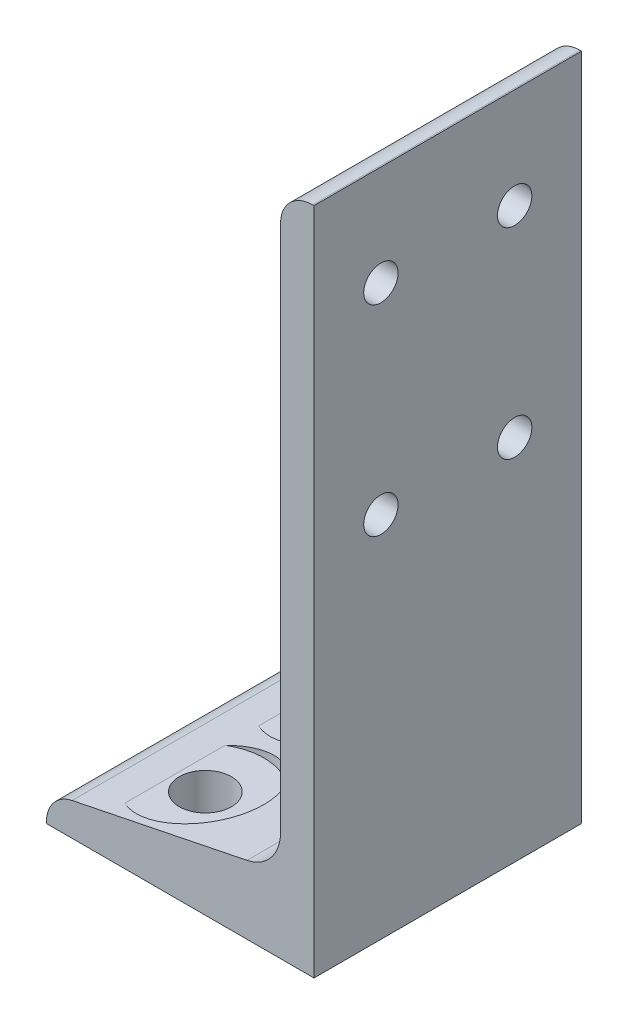
ISO-10303-21;
HEADER;
FILE_DESCRIPTION(('STEP AP214'),'2;1');
FILE_NAME('part.step','',(''),(''),'','','');
FILE_SCHEMA(('AUTOMOTIVE_DESIGN { 1 0 10303 214 1 1 1 1 }'));
ENDSEC;
DATA;
#1=APPLICATION_CONTEXT('core data for automotive mechanical design processes');
#2=APPLICATION_PROTOCOL_DEFINITION('international standard','automotive_design',2000,#1);
#3=PRODUCT_CONTEXT('',#1,'mechanical');
#4=PRODUCT('Part','Part','',(#3));
#5=PRODUCT_RELATED_PRODUCT_CATEGORY('part','',(#4));
#6=PRODUCT_DEFINITION_FORMATION('','',#4);
#7=PRODUCT_DEFINITION_CONTEXT('part definition',#1,'design');
#8=PRODUCT_DEFINITION('design','',#6,#7);
#9=PRODUCT_DEFINITION_SHAPE('','',#8);
#10=(LENGTH_UNIT() NAMED_UNIT(*) SI_UNIT(.MILLI.,.METRE.));
#11=(NAMED_UNIT(*) PLANE_ANGLE_UNIT() SI_UNIT($,.RADIAN.));
#12=(NAMED_UNIT(*) SI_UNIT($,.STERADIAN.) SOLID_ANGLE_UNIT());
#13=UNCERTAINTY_MEASURE_WITH_UNIT(LENGTH_MEASURE(1.E-05),#10,'distance_accuracy_value','');
#14=(GEOMETRIC_REPRESENTATION_CONTEXT(3) GLOBAL_UNCERTAINTY_ASSIGNED_CONTEXT((#13)) GLOBAL_UNIT_ASSIGNED_CONTEXT((#10,
#11,#12)) REPRESENTATION_CONTEXT('',''));
#15=CARTESIAN_POINT('',(0.,0.,0.));
#16=DIRECTION('',(0.,0.,1.));
#17=DIRECTION('',(1.,0.,0.));
#18=AXIS2_PLACEMENT_3D('',#15,#16,#17);
#19=CARTESIAN_POINT('',(-45.9207101191459,6.22734349305051,25.4));
#20=DIRECTION('',(0.199591554978008,-0.979879181930844,0.));
#21=DIRECTION('',(0.979879181930844,0.199591554978008,0.));
#22=AXIS2_PLACEMENT_3D('',#19,#20,#21);
#23=PLANE('',#22);
#24=CARTESIAN_POINT('',(-33.3247999999999,8.79300396773239,12.7000000000001));
#25=DIRECTION('',(0.199591554978008,-0.979879181930844,0.));
#26=DIRECTION('',(-0.979879181930844,-0.199591554978008,0.));
#27=AXIS2_PLACEMENT_3D('',#24,#25,#26);
#28=ELLIPSE('',#27,11.340683836249,11.1125);
#29=CARTESIAN_POINT('',(-39.0835715493763,7.6200000000001,22.203904802348));
#30=VERTEX_POINT('',#29);
#31=CARTESIAN_POINT('',(-39.0835715493763,7.61999999999999,3.19609519765196));
#32=VERTEX_POINT('',#31);
#33=EDGE_CURVE('E119',#30,#32,#28,.F.);
#34=ORIENTED_EDGE('',*,*,#33,.F.);
#35=DIRECTION('',(0.,0.,1.));
#36=VECTOR('',#35,1.);
#37=CARTESIAN_POINT('',(-39.0835715493763,7.6200000000001,25.4));
#38=LINE('',#37,#36);
#39=EDGE_CURVE('E312',#32,#30,#38,.T.);
#40=ORIENTED_EDGE('',*,*,#39,.F.);
#41=EDGE_LOOP('',(#34,#40));
#42=FACE_BOUND('',#41,.T.);
#43=DIRECTION('',(-0.979879181930845,-0.199591554978008,0.));
#44=VECTOR('',#43,1.);
#45=CARTESIAN_POINT('',(-45.9207101191459,6.22734349305051,-25.4));
#46=LINE('',#45,#44);
#47=CARTESIAN_POINT('',(-12.7032420323621,12.9934083611798,-25.4));
#48=VERTEX_POINT('',#47);
#49=CARTESIAN_POINT('',(-45.9207101191459,6.22734349305051,-25.4));
#50=VERTEX_POINT('',#49);
#51=EDGE_CURVE('E271',#48,#50,#46,.T.);
#52=ORIENTED_EDGE('',*,*,#51,.T.);
#53=DIRECTION('',(0.,0.,-1.));
#54=VECTOR('',#53,1.);
#55=CARTESIAN_POINT('',(-45.9207101191459,6.22734349305051,25.4));
#56=LINE('',#55,#54);
#57=CARTESIAN_POINT('',(-45.9207101191459,6.22734349305051,25.4));
#58=VERTEX_POINT('',#57);
#59=EDGE_CURVE('E306',#58,#50,#56,.T.);
#60=ORIENTED_EDGE('',*,*,#59,.F.);
#61=DIRECTION('',(-0.979879181930845,-0.199591554978008,0.));
#62=VECTOR('',#61,1.);
#63=CARTESIAN_POINT('',(-45.9207101191459,6.22734349305051,25.4));
#64=LINE('',#63,#62);
#65=CARTESIAN_POINT('',(-12.7032420323621,12.9934083611798,25.4));
#66=VERTEX_POINT('',#65);
#67=EDGE_CURVE('E251',#66,#58,#64,.T.);
#68=ORIENTED_EDGE('',*,*,#67,.F.);
#69=DIRECTION('',(0.,0.,-1.));
#70=VECTOR('',#69,1.);
#71=CARTESIAN_POINT('',(-12.7032420323621,12.9934083611798,25.4));
#72=LINE('',#71,#70);
#73=EDGE_CURVE('E309',#66,#48,#72,.T.);
#74=ORIENTED_EDGE('',*,*,#73,.T.);
#75=EDGE_LOOP('',(#52,#60,#68,#74));
#76=FACE_BOUND('',#75,.T.);
#77=CARTESIAN_POINT('',(-33.3247999999999,8.79300396773239,-12.7000000000001));
#78=DIRECTION('',(0.199591554978008,-0.979879181930844,0.));
#79=DIRECTION('',(-0.979879181930844,-0.199591554978008,0.));
#80=AXIS2_PLACEMENT_3D('',#77,#78,#79);
#81=ELLIPSE('',#80,11.340683836249,11.1125);
#82=CARTESIAN_POINT('',(-39.0835715493763,7.61999999999999,-3.19609519765196));
#83=VERTEX_POINT('',#82);
#84=CARTESIAN_POINT('',(-39.0835715493763,7.62000000000013,-22.203904802348));
#85=VERTEX_POINT('',#84);
#86=EDGE_CURVE('E11',#83,#85,#81,.F.);
#87=ORIENTED_EDGE('',*,*,#86,.F.);
#88=DIRECTION('',(0.,0.,1.));
#89=VECTOR('',#88,1.);
#90=CARTESIAN_POINT('',(-39.0835715493763,7.6200000000001,25.4));
#91=LINE('',#90,#89);
#92=EDGE_CURVE('E44',#85,#83,#91,.T.);
#93=ORIENTED_EDGE('',*,*,#92,.F.);
#94=EDGE_LOOP('',(#87,#93));
#95=FACE_BOUND('',#94,.T.);
#96=ADVANCED_FACE('F36',(#42,#76,#95),#23,.F.);
#97=CARTESIAN_POINT('',(-14.2875,20.7711993677559,25.4));
#98=DIRECTION('',(0.,0.,-1.));
#99=DIRECTION('',(-1.,0.,0.));
#100=AXIS2_PLACEMENT_3D('',#97,#98,#99);
#101=CYLINDRICAL_SURFACE('',#100,7.9375);
#102=CARTESIAN_POINT('',(-14.2875,20.7711993677559,-25.4));
#103=DIRECTION('',(0.,0.,-1.));
#104=DIRECTION('',(1.,0.,0.));
#105=AXIS2_PLACEMENT_3D('',#102,#103,#104);
#106=CIRCLE('',#105,7.9375);
#107=CARTESIAN_POINT('',(-6.35000000000008,20.7711993677559,-25.4));
#108=VERTEX_POINT('',#107);
#109=EDGE_CURVE('E247',#108,#48,#106,.T.);
#110=ORIENTED_EDGE('',*,*,#109,.T.);
#111=ORIENTED_EDGE('',*,*,#73,.F.);
#112=CARTESIAN_POINT('',(-14.2875,20.7711993677559,25.4));
#113=DIRECTION('',(0.,0.,-1.));
#114=DIRECTION('',(1.,0.,0.));
#115=AXIS2_PLACEMENT_3D('',#112,#113,#114);
#116=CIRCLE('',#115,7.9375);
#117=CARTESIAN_POINT('',(-6.35000000000008,20.7711993677559,25.4));
#118=VERTEX_POINT('',#117);
#119=EDGE_CURVE('E248',#118,#66,#116,.T.);
#120=ORIENTED_EDGE('',*,*,#119,.F.);
#121=DIRECTION('',(0.,0.,-1.));
#122=VECTOR('',#121,1.);
#123=CARTESIAN_POINT('',(-6.35000000000008,20.7711993677559,25.4));
#124=LINE('',#123,#122);
#125=EDGE_CURVE('E268',#118,#108,#124,.T.);
#126=ORIENTED_EDGE('',*,*,#125,.T.);
#127=EDGE_LOOP('',(#110,#111,#120,#126));
#128=FACE_BOUND('',#127,.T.);
#129=ADVANCED_FACE('F38',(#128),#101,.F.);
#130=CARTESIAN_POINT('',(-44.7040000000001,0.254000000000087,25.4));
#131=DIRECTION('',(0.,0.,-1.));
#132=DIRECTION('',(-1.,0.,0.));
#133=AXIS2_PLACEMENT_3D('',#130,#131,#132);
#134=CYLINDRICAL_SURFACE('',#133,6.09599999999999);
#135=CARTESIAN_POINT('',(-44.7040000000001,0.254000000000115,-25.4));
#136=DIRECTION('',(0.,0.,1.));
#137=DIRECTION('',(-1.,0.,0.));
#138=AXIS2_PLACEMENT_3D('',#135,#136,#137);
#139=CIRCLE('',#138,6.09599999999999);
#140=CARTESIAN_POINT('',(-50.8,0.254000000000115,-25.4));
#141=VERTEX_POINT('',#140);
#142=EDGE_CURVE('E273',#50,#141,#139,.T.);
#143=ORIENTED_EDGE('',*,*,#142,.T.);
#144=DIRECTION('',(0.,0.,-1.));
#145=VECTOR('',#144,1.);
#146=CARTESIAN_POINT('',(-50.8,0.254000000000087,25.4));
#147=LINE('',#146,#145);
#148=CARTESIAN_POINT('',(-50.8,0.254000000000087,25.4));
#149=VERTEX_POINT('',#148);
#150=EDGE_CURVE('E303',#149,#141,#147,.T.);
#151=ORIENTED_EDGE('',*,*,#150,.F.);
#152=CARTESIAN_POINT('',(-44.7040000000001,0.254000000000087,25.4));
#153=DIRECTION('',(0.,0.,1.));
#154=DIRECTION('',(-1.,0.,0.));
#155=AXIS2_PLACEMENT_3D('',#152,#153,#154);
#156=CIRCLE('',#155,6.09599999999999);
#157=EDGE_CURVE('E254',#58,#149,#156,.T.);
#158=ORIENTED_EDGE('',*,*,#157,.F.);
#159=ORIENTED_EDGE('',*,*,#59,.T.);
#160=EDGE_LOOP('',(#143,#151,#158,#159));
#161=FACE_BOUND('',#160,.T.);
#162=ADVANCED_FACE('F129',(#161),#134,.T.);
#163=CARTESIAN_POINT('',(-50.8,1.11022302462516E-13,25.4));
#164=DIRECTION('',(1.,0.,0.));
#165=DIRECTION('',(0.,0.,-1.));
#166=AXIS2_PLACEMENT_3D('',#163,#164,#165);
#167=PLANE('',#166);
#168=DIRECTION('',(0.,-1.,0.));
#169=VECTOR('',#168,1.);
#170=CARTESIAN_POINT('',(-50.8,1.11022302462516E-13,-25.4));
#171=LINE('',#170,#169);
#172=CARTESIAN_POINT('',(-50.8,1.11022302462516E-13,-25.4));
#173=VERTEX_POINT('',#172);
#174=EDGE_CURVE('E275',#141,#173,#171,.T.);
#175=ORIENTED_EDGE('',*,*,#174,.T.);
#176=DIRECTION('',(0.,0.,-1.));
#177=VECTOR('',#176,1.);
#178=CARTESIAN_POINT('',(-50.8,1.11022302462516E-13,25.4));
#179=LINE('',#178,#177);
#180=CARTESIAN_POINT('',(-50.8,1.11022302462516E-13,25.4));
#181=VERTEX_POINT('',#180);
#182=EDGE_CURVE('E300',#181,#173,#179,.T.);
#183=ORIENTED_EDGE('',*,*,#182,.F.);
#184=DIRECTION('',(0.,-1.,0.));
#185=VECTOR('',#184,1.);
#186=CARTESIAN_POINT('',(-50.8,1.11022302462516E-13,25.4));
#187=LINE('',#186,#185);
#188=EDGE_CURVE('E256',#149,#181,#187,.T.);
#189=ORIENTED_EDGE('',*,*,#188,.F.);
#190=ORIENTED_EDGE('',*,*,#150,.T.);
#191=EDGE_LOOP('',(#175,#183,#189,#190));
#192=FACE_BOUND('',#191,.T.);
#193=ADVANCED_FACE('F136',(#192),#167,.F.);
#194=CARTESIAN_POINT('',(0.,1.11022302462516E-13,25.4));
#195=DIRECTION('',(0.,1.,0.));
#196=DIRECTION('',(-1.,0.,0.));
#197=AXIS2_PLACEMENT_3D('',#194,#195,#196);
#198=PLANE('',#197);
#199=CARTESIAN_POINT('',(-33.3247999999999,1.11022302462516E-13,-12.7000000000001));
#200=DIRECTION('',(0.,1.,0.));
#201=DIRECTION('',(0.,0.,1.));
#202=AXIS2_PLACEMENT_3D('',#199,#200,#201);
#203=CIRCLE('',#202,4.95299999999999);
#204=CARTESIAN_POINT('',(-33.3247999999999,1.11022302462516E-13,-7.74700000000008));
#205=VERTEX_POINT('',#204);
#206=EDGE_CURVE('E236',#205,#205,#203,.T.);
#207=ORIENTED_EDGE('',*,*,#206,.T.);
#208=EDGE_LOOP('',(#207));
#209=FACE_BOUND('',#208,.T.);
#210=CARTESIAN_POINT('',(-33.3247999999999,1.11022302462516E-13,12.7000000000001));
#211=DIRECTION('',(0.,1.,0.));
#212=DIRECTION('',(0.,0.,1.));
#213=AXIS2_PLACEMENT_3D('',#210,#211,#212);
#214=CIRCLE('',#213,4.953);
#215=CARTESIAN_POINT('',(-33.3247999999999,1.11022302462516E-13,17.6530000000001));
#216=VERTEX_POINT('',#215);
#217=EDGE_CURVE('E122',#216,#216,#214,.T.);
#218=ORIENTED_EDGE('',*,*,#217,.T.);
#219=EDGE_LOOP('',(#218));
#220=FACE_BOUND('',#219,.T.);
#221=DIRECTION('',(1.,0.,0.));
#222=VECTOR('',#221,1.);
#223=CARTESIAN_POINT('',(0.,1.11022302462516E-13,-25.4));
#224=LINE('',#223,#222);
#225=CARTESIAN_POINT('',(0.,1.11022302462516E-13,-25.4));
#226=VERTEX_POINT('',#225);
#227=EDGE_CURVE('E277',#173,#226,#224,.T.);
#228=ORIENTED_EDGE('',*,*,#227,.T.);
#229=DIRECTION('',(0.,0.,-1.));
#230=VECTOR('',#229,1.);
#231=CARTESIAN_POINT('',(0.,1.11022302462516E-13,25.4));
#232=LINE('',#231,#230);
#233=CARTESIAN_POINT('',(0.,1.11022302462516E-13,25.4));
#234=VERTEX_POINT('',#233);
#235=EDGE_CURVE('E297',#234,#226,#232,.T.);
#236=ORIENTED_EDGE('',*,*,#235,.F.);
#237=DIRECTION('',(1.,0.,0.));
#238=VECTOR('',#237,1.);
#239=CARTESIAN_POINT('',(0.,1.11022302462516E-13,25.4));
#240=LINE('',#239,#238);
#241=EDGE_CURVE('E258',#181,#234,#240,.T.);
#242=ORIENTED_EDGE('',*,*,#241,.F.);
#243=ORIENTED_EDGE('',*,*,#182,.T.);
#244=EDGE_LOOP('',(#228,#236,#242,#243));
#245=FACE_BOUND('',#244,.T.);
#246=ADVANCED_FACE('F140',(#209,#220,#245),#198,.F.);
#247=CARTESIAN_POINT('',(0.,127.,25.4));
#248=DIRECTION('',(-1.,0.,0.));
#249=DIRECTION('',(0.,-1.,0.));
#250=AXIS2_PLACEMENT_3D('',#247,#248,#249);
#251=PLANE('',#250);
#252=CARTESIAN_POINT('',(0.,69.8500000000001,12.7));
#253=DIRECTION('',(-1.,0.,0.));
#254=DIRECTION('',(0.,-1.,0.));
#255=AXIS2_PLACEMENT_3D('',#252,#253,#254);
#256=CIRCLE('',#255,3.2639);
#257=CARTESIAN_POINT('',(0.,66.5861000000001,12.7));
#258=VERTEX_POINT('',#257);
#259=EDGE_CURVE('E210',#258,#258,#256,.T.);
#260=ORIENTED_EDGE('',*,*,#259,.T.);
#261=EDGE_LOOP('',(#260));
#262=FACE_BOUND('',#261,.T.);
#263=CARTESIAN_POINT('',(0.,107.95,12.7));
#264=DIRECTION('',(-1.,0.,0.));
#265=DIRECTION('',(0.,-1.,0.));
#266=AXIS2_PLACEMENT_3D('',#263,#264,#265);
#267=CIRCLE('',#266,3.2639);
#268=CARTESIAN_POINT('',(0.,104.6861,12.7));
#269=VERTEX_POINT('',#268);
#270=EDGE_CURVE('E218',#269,#269,#267,.T.);
#271=ORIENTED_EDGE('',*,*,#270,.T.);
#272=EDGE_LOOP('',(#271));
#273=FACE_BOUND('',#272,.T.);
#274=CARTESIAN_POINT('',(0.,107.95,-12.7));
#275=DIRECTION('',(-1.,0.,0.));
#276=DIRECTION('',(0.,-1.,0.));
#277=AXIS2_PLACEMENT_3D('',#274,#275,#276);
#278=CIRCLE('',#277,3.2639);
#279=CARTESIAN_POINT('',(0.,104.6861,-12.7));
#280=VERTEX_POINT('',#279);
#281=EDGE_CURVE('E224',#280,#280,#278,.T.);
#282=ORIENTED_EDGE('',*,*,#281,.T.);
#283=EDGE_LOOP('',(#282));
#284=FACE_BOUND('',#283,.T.);
#285=CARTESIAN_POINT('',(0.,69.8500000000001,-12.7));
#286=DIRECTION('',(-1.,0.,0.));
#287=DIRECTION('',(0.,-1.,0.));
#288=AXIS2_PLACEMENT_3D('',#285,#286,#287);
#289=CIRCLE('',#288,3.2639);
#290=CARTESIAN_POINT('',(0.,66.5861000000001,-12.7));
#291=VERTEX_POINT('',#290);
#292=EDGE_CURVE('E230',#291,#291,#289,.T.);
#293=ORIENTED_EDGE('',*,*,#292,.T.);
#294=EDGE_LOOP('',(#293));
#295=FACE_BOUND('',#294,.T.);
#296=DIRECTION('',(0.,1.,0.));
#297=VECTOR('',#296,1.);
#298=CARTESIAN_POINT('',(0.,127.,-25.4));
#299=LINE('',#298,#297);
#300=CARTESIAN_POINT('',(0.,127.,-25.4));
#301=VERTEX_POINT('',#300);
#302=EDGE_CURVE('E279',#226,#301,#299,.T.);
#303=ORIENTED_EDGE('',*,*,#302,.T.);
#304=DIRECTION('',(0.,0.,-1.));
#305=VECTOR('',#304,1.);
#306=CARTESIAN_POINT('',(0.,127.,25.4));
#307=LINE('',#306,#305);
#308=CARTESIAN_POINT('',(0.,127.,25.4));
#309=VERTEX_POINT('',#308);
#310=EDGE_CURVE('E294',#309,#301,#307,.T.);
#311=ORIENTED_EDGE('',*,*,#310,.F.);
#312=DIRECTION('',(0.,1.,0.));
#313=VECTOR('',#312,1.);
#314=CARTESIAN_POINT('',(0.,127.,25.4));
#315=LINE('',#314,#313);
#316=EDGE_CURVE('E260',#234,#309,#315,.T.);
#317=ORIENTED_EDGE('',*,*,#316,.F.);
#318=ORIENTED_EDGE('',*,*,#235,.T.);
#319=EDGE_LOOP('',(#303,#311,#317,#318));
#320=FACE_BOUND('',#319,.T.);
#321=ADVANCED_FACE('F144',(#262,#273,#284,#295,#320),#251,.F.);
#322=CARTESIAN_POINT('',(-0.253999999999976,127.,25.4));
#323=DIRECTION('',(0.,-1.,0.));
#324=DIRECTION('',(0.,0.,-1.));
#325=AXIS2_PLACEMENT_3D('',#322,#323,#324);
#326=PLANE('',#325);
#327=DIRECTION('',(-1.,0.,0.));
#328=VECTOR('',#327,1.);
#329=CARTESIAN_POINT('',(-0.253999999999976,127.,-25.4));
#330=LINE('',#329,#328);
#331=CARTESIAN_POINT('',(-0.253999999999976,127.,-25.4));
#332=VERTEX_POINT('',#331);
#333=EDGE_CURVE('E281',#301,#332,#330,.T.);
#334=ORIENTED_EDGE('',*,*,#333,.T.);
#335=DIRECTION('',(0.,0.,-1.));
#336=VECTOR('',#335,1.);
#337=CARTESIAN_POINT('',(-0.253999999999976,127.,25.4));
#338=LINE('',#337,#336);
#339=CARTESIAN_POINT('',(-0.253999999999976,127.,25.4));
#340=VERTEX_POINT('',#339);
#341=EDGE_CURVE('E291',#340,#332,#338,.T.);
#342=ORIENTED_EDGE('',*,*,#341,.F.);
#343=DIRECTION('',(-1.,0.,0.));
#344=VECTOR('',#343,1.);
#345=CARTESIAN_POINT('',(-0.253999999999976,127.,25.4));
#346=LINE('',#345,#344);
#347=EDGE_CURVE('E262',#309,#340,#346,.T.);
#348=ORIENTED_EDGE('',*,*,#347,.F.);
#349=ORIENTED_EDGE('',*,*,#310,.T.);
#350=EDGE_LOOP('',(#334,#342,#348,#349));
#351=FACE_BOUND('',#350,.T.);
#352=ADVANCED_FACE('F148',(#351),#326,.F.);
#353=CARTESIAN_POINT('',(-0.253999999999976,120.904,25.4));
#354=DIRECTION('',(0.,0.,-1.));
#355=DIRECTION('',(-1.,0.,0.));
#356=AXIS2_PLACEMENT_3D('',#353,#354,#355);
#357=CYLINDRICAL_SURFACE('',#356,6.096);
#358=CARTESIAN_POINT('',(-0.253999999999976,120.904,-25.4));
#359=DIRECTION('',(0.,0.,1.));
#360=DIRECTION('',(-1.,0.,0.));
#361=AXIS2_PLACEMENT_3D('',#358,#359,#360);
#362=CIRCLE('',#361,6.096);
#363=CARTESIAN_POINT('',(-6.35000000000008,120.904,-25.4));
#364=VERTEX_POINT('',#363);
#365=EDGE_CURVE('E283',#332,#364,#362,.T.);
#366=ORIENTED_EDGE('',*,*,#365,.T.);
#367=DIRECTION('',(0.,0.,-1.));
#368=VECTOR('',#367,1.);
#369=CARTESIAN_POINT('',(-6.35000000000008,120.904,25.4));
#370=LINE('',#369,#368);
#371=CARTESIAN_POINT('',(-6.35000000000008,120.904,25.4));
#372=VERTEX_POINT('',#371);
#373=EDGE_CURVE('E288',#372,#364,#370,.T.);
#374=ORIENTED_EDGE('',*,*,#373,.F.);
#375=CARTESIAN_POINT('',(-0.253999999999976,120.904,25.4));
#376=DIRECTION('',(0.,0.,1.));
#377=DIRECTION('',(-1.,0.,0.));
#378=AXIS2_PLACEMENT_3D('',#375,#376,#377);
#379=CIRCLE('',#378,6.096);
#380=EDGE_CURVE('E264',#340,#372,#379,.T.);
#381=ORIENTED_EDGE('',*,*,#380,.F.);
#382=ORIENTED_EDGE('',*,*,#341,.T.);
#383=EDGE_LOOP('',(#366,#374,#381,#382));
#384=FACE_BOUND('',#383,.T.);
#385=ADVANCED_FACE('F152',(#384),#357,.T.);
#386=CARTESIAN_POINT('',(-6.35000000000008,20.7711993677559,25.4));
#387=DIRECTION('',(1.,0.,0.));
#388=DIRECTION('',(0.,1.,0.));
#389=AXIS2_PLACEMENT_3D('',#386,#387,#388);
#390=PLANE('',#389);
#391=CARTESIAN_POINT('',(-6.35000000000008,69.8500000000001,12.7));
#392=DIRECTION('',(-1.,0.,0.));
#393=DIRECTION('',(0.,-1.,0.));
#394=AXIS2_PLACEMENT_3D('',#391,#392,#393);
#395=CIRCLE('',#394,3.2639);
#396=CARTESIAN_POINT('',(-6.35000000000008,66.5861000000001,12.7));
#397=VERTEX_POINT('',#396);
#398=EDGE_CURVE('E213',#397,#397,#395,.T.);
#399=ORIENTED_EDGE('',*,*,#398,.F.);
#400=EDGE_LOOP('',(#399));
#401=FACE_BOUND('',#400,.T.);
#402=CARTESIAN_POINT('',(-6.35000000000008,107.95,12.7));
#403=DIRECTION('',(-1.,0.,0.));
#404=DIRECTION('',(0.,-1.,0.));
#405=AXIS2_PLACEMENT_3D('',#402,#403,#404);
#406=CIRCLE('',#405,3.2639);
#407=CARTESIAN_POINT('',(-6.35000000000008,104.6861,12.7));
#408=VERTEX_POINT('',#407);
#409=EDGE_CURVE('E215',#408,#408,#406,.T.);
#410=ORIENTED_EDGE('',*,*,#409,.F.);
#411=EDGE_LOOP('',(#410));
#412=FACE_BOUND('',#411,.T.);
#413=CARTESIAN_POINT('',(-6.35000000000008,107.95,-12.7));
#414=DIRECTION('',(-1.,0.,0.));
#415=DIRECTION('',(0.,-1.,0.));
#416=AXIS2_PLACEMENT_3D('',#413,#414,#415);
#417=CIRCLE('',#416,3.2639);
#418=CARTESIAN_POINT('',(-6.35000000000008,104.6861,-12.7));
#419=VERTEX_POINT('',#418);
#420=EDGE_CURVE('E221',#419,#419,#417,.T.);
#421=ORIENTED_EDGE('',*,*,#420,.F.);
#422=EDGE_LOOP('',(#421));
#423=FACE_BOUND('',#422,.T.);
#424=CARTESIAN_POINT('',(-6.35000000000008,69.8500000000001,-12.7));
#425=DIRECTION('',(-1.,0.,0.));
#426=DIRECTION('',(0.,-1.,0.));
#427=AXIS2_PLACEMENT_3D('',#424,#425,#426);
#428=CIRCLE('',#427,3.2639);
#429=CARTESIAN_POINT('',(-6.35000000000008,66.5861000000001,-12.7));
#430=VERTEX_POINT('',#429);
#431=EDGE_CURVE('E227',#430,#430,#428,.T.);
#432=ORIENTED_EDGE('',*,*,#431,.F.);
#433=EDGE_LOOP('',(#432));
#434=FACE_BOUND('',#433,.T.);
#435=DIRECTION('',(0.,-1.,0.));
#436=VECTOR('',#435,1.);
#437=CARTESIAN_POINT('',(-6.35000000000008,20.7711993677559,-25.4));
#438=LINE('',#437,#436);
#439=EDGE_CURVE('E252',#364,#108,#438,.T.);
#440=ORIENTED_EDGE('',*,*,#439,.T.);
#441=ORIENTED_EDGE('',*,*,#125,.F.);
#442=DIRECTION('',(0.,-1.,0.));
#443=VECTOR('',#442,1.);
#444=CARTESIAN_POINT('',(-6.35000000000008,20.7711993677559,25.4));
#445=LINE('',#444,#443);
#446=EDGE_CURVE('E266',#372,#118,#445,.T.);
#447=ORIENTED_EDGE('',*,*,#446,.F.);
#448=ORIENTED_EDGE('',*,*,#373,.T.);
#449=EDGE_LOOP('',(#440,#441,#447,#448));
#450=FACE_BOUND('',#449,.T.);
#451=ADVANCED_FACE('F156',(#401,#412,#423,#434,#450),#390,.F.);
#452=CARTESIAN_POINT('',(-14.2875,20.7711993677559,25.4));
#453=DIRECTION('',(0.,0.,1.));
#454=DIRECTION('',(1.,0.,0.));
#455=AXIS2_PLACEMENT_3D('',#452,#453,#454);
#456=PLANE('',#455);
#457=ORIENTED_EDGE('',*,*,#119,.T.);
#458=ORIENTED_EDGE('',*,*,#67,.T.);
#459=ORIENTED_EDGE('',*,*,#157,.T.);
#460=ORIENTED_EDGE('',*,*,#188,.T.);
#461=ORIENTED_EDGE('',*,*,#241,.T.);
#462=ORIENTED_EDGE('',*,*,#316,.T.);
#463=ORIENTED_EDGE('',*,*,#347,.T.);
#464=ORIENTED_EDGE('',*,*,#380,.T.);
#465=ORIENTED_EDGE('',*,*,#446,.T.);
#466=EDGE_LOOP('',(#457,#458,#459,#460,#461,#462,#463,#464,#465));
#467=FACE_BOUND('',#466,.T.);
#468=ADVANCED_FACE('F160',(#467),#456,.T.);
#469=CARTESIAN_POINT('',(-14.2875,20.7711993677559,-25.4));
#470=DIRECTION('',(0.,0.,1.));
#471=DIRECTION('',(1.,0.,0.));
#472=AXIS2_PLACEMENT_3D('',#469,#470,#471);
#473=PLANE('',#472);
#474=ORIENTED_EDGE('',*,*,#109,.F.);
#475=ORIENTED_EDGE('',*,*,#439,.F.);
#476=ORIENTED_EDGE('',*,*,#365,.F.);
#477=ORIENTED_EDGE('',*,*,#333,.F.);
#478=ORIENTED_EDGE('',*,*,#302,.F.);
#479=ORIENTED_EDGE('',*,*,#227,.F.);
#480=ORIENTED_EDGE('',*,*,#174,.F.);
#481=ORIENTED_EDGE('',*,*,#142,.F.);
#482=ORIENTED_EDGE('',*,*,#51,.F.);
#483=EDGE_LOOP('',(#474,#475,#476,#477,#478,#479,#480,#481,#482));
#484=FACE_BOUND('',#483,.T.);
#485=ADVANCED_FACE('F162',(#484),#473,.F.);
#486=CARTESIAN_POINT('',(-33.3247999999999,127.,12.7));
#487=DIRECTION('',(0.,-1.,0.));
#488=DIRECTION('',(0.,0.,-1.));
#489=AXIS2_PLACEMENT_3D('',#486,#487,#488);
#490=CYLINDRICAL_SURFACE('',#489,11.1125);
#491=ORIENTED_EDGE('',*,*,#33,.T.);
#492=CARTESIAN_POINT('',(-33.3247999999999,7.6200000000001,12.7000000000001));
#493=DIRECTION('',(0.,1.,0.));
#494=DIRECTION('',(0.,0.,1.));
#495=AXIS2_PLACEMENT_3D('',#492,#493,#494);
#496=CIRCLE('',#495,11.1125);
#497=EDGE_CURVE('E56',#30,#32,#496,.T.);
#498=ORIENTED_EDGE('',*,*,#497,.F.);
#499=EDGE_LOOP('',(#491,#498));
#500=FACE_BOUND('',#499,.T.);
#501=ADVANCED_FACE('F165',(#500),#490,.F.);
#502=CARTESIAN_POINT('',(-33.3247999999999,7.6200000000001,12.7000000000001));
#503=DIRECTION('',(0.,1.,0.));
#504=DIRECTION('',(0.,0.,1.));
#505=AXIS2_PLACEMENT_3D('',#502,#503,#504);
#506=PLANE('',#505);
#507=CARTESIAN_POINT('',(-33.3247999999999,7.6200000000001,12.7000000000001));
#508=DIRECTION('',(0.,1.,0.));
#509=DIRECTION('',(0.,0.,1.));
#510=AXIS2_PLACEMENT_3D('',#507,#508,#509);
#511=CIRCLE('',#510,4.953);
#512=CARTESIAN_POINT('',(-33.3247999999999,7.6200000000001,17.6530000000001));
#513=VERTEX_POINT('',#512);
#514=EDGE_CURVE('E239',#513,#513,#511,.T.);
#515=ORIENTED_EDGE('',*,*,#514,.F.);
#516=EDGE_LOOP('',(#515));
#517=FACE_BOUND('',#516,.T.);
#518=ORIENTED_EDGE('',*,*,#39,.T.);
#519=ORIENTED_EDGE('',*,*,#497,.T.);
#520=EDGE_LOOP('',(#518,#519));
#521=FACE_BOUND('',#520,.T.);
#522=ADVANCED_FACE('F172',(#517,#521),#506,.T.);
#523=CARTESIAN_POINT('',(-33.3247999999999,127.,-12.7));
#524=DIRECTION('',(0.,-1.,0.));
#525=DIRECTION('',(0.,0.,-1.));
#526=AXIS2_PLACEMENT_3D('',#523,#524,#525);
#527=CYLINDRICAL_SURFACE('',#526,11.1125);
#528=ORIENTED_EDGE('',*,*,#86,.T.);
#529=CARTESIAN_POINT('',(-33.3247999999999,7.62000000000013,-12.7000000000001));
#530=DIRECTION('',(0.,1.,0.));
#531=DIRECTION('',(0.,0.,1.));
#532=AXIS2_PLACEMENT_3D('',#529,#530,#531);
#533=CIRCLE('',#532,11.1125);
#534=EDGE_CURVE('E50',#83,#85,#533,.T.);
#535=ORIENTED_EDGE('',*,*,#534,.F.);
#536=EDGE_LOOP('',(#528,#535));
#537=FACE_BOUND('',#536,.T.);
#538=ADVANCED_FACE('F121',(#537),#527,.F.);
#539=CARTESIAN_POINT('',(-33.3247999999999,7.62000000000013,-12.7000000000001));
#540=DIRECTION('',(0.,1.,0.));
#541=DIRECTION('',(0.,0.,1.));
#542=AXIS2_PLACEMENT_3D('',#539,#540,#541);
#543=PLANE('',#542);
#544=CARTESIAN_POINT('',(-33.3247999999999,7.62000000000013,-12.7000000000001));
#545=DIRECTION('',(0.,1.,0.));
#546=DIRECTION('',(0.,0.,1.));
#547=AXIS2_PLACEMENT_3D('',#544,#545,#546);
#548=CIRCLE('',#547,4.95299999999999);
#549=CARTESIAN_POINT('',(-33.3247999999999,7.62000000000013,-7.74700000000008));
#550=VERTEX_POINT('',#549);
#551=EDGE_CURVE('E233',#550,#550,#548,.T.);
#552=ORIENTED_EDGE('',*,*,#551,.F.);
#553=EDGE_LOOP('',(#552));
#554=FACE_BOUND('',#553,.T.);
#555=ORIENTED_EDGE('',*,*,#92,.T.);
#556=ORIENTED_EDGE('',*,*,#534,.T.);
#557=EDGE_LOOP('',(#555,#556));
#558=FACE_BOUND('',#557,.T.);
#559=ADVANCED_FACE('F116',(#554,#558),#543,.T.);
#560=CARTESIAN_POINT('',(-33.3247999999999,1.11022302462516E-13,12.7000000000001));
#561=DIRECTION('',(0.,1.,0.));
#562=DIRECTION('',(0.,0.,1.));
#563=AXIS2_PLACEMENT_3D('',#560,#561,#562);
#564=CYLINDRICAL_SURFACE('',#563,4.953);
#565=ORIENTED_EDGE('',*,*,#217,.F.);
#566=EDGE_LOOP('',(#565));
#567=FACE_BOUND('',#566,.T.);
#568=ORIENTED_EDGE('',*,*,#514,.T.);
#569=EDGE_LOOP('',(#568));
#570=FACE_BOUND('',#569,.T.);
#571=ADVANCED_FACE('F181',(#567,#570),#564,.F.);
#572=CARTESIAN_POINT('',(-33.3247999999999,1.11022302462516E-13,-12.7000000000001));
#573=DIRECTION('',(0.,1.,0.));
#574=DIRECTION('',(0.,0.,1.));
#575=AXIS2_PLACEMENT_3D('',#572,#573,#574);
#576=CYLINDRICAL_SURFACE('',#575,4.95299999999999);
#577=ORIENTED_EDGE('',*,*,#206,.F.);
#578=EDGE_LOOP('',(#577));
#579=FACE_BOUND('',#578,.T.);
#580=ORIENTED_EDGE('',*,*,#551,.T.);
#581=EDGE_LOOP('',(#580));
#582=FACE_BOUND('',#581,.T.);
#583=ADVANCED_FACE('F185',(#579,#582),#576,.F.);
#584=CARTESIAN_POINT('',(0.,69.8500000000001,-12.7));
#585=DIRECTION('',(-1.,0.,0.));
#586=DIRECTION('',(0.,-1.,0.));
#587=AXIS2_PLACEMENT_3D('',#584,#585,#586);
#588=CYLINDRICAL_SURFACE('',#587,3.2639);
#589=ORIENTED_EDGE('',*,*,#292,.F.);
#590=EDGE_LOOP('',(#589));
#591=FACE_BOUND('',#590,.T.);
#592=ORIENTED_EDGE('',*,*,#431,.T.);
#593=EDGE_LOOP('',(#592));
#594=FACE_BOUND('',#593,.T.);
#595=ADVANCED_FACE('F189',(#591,#594),#588,.F.);
#596=CARTESIAN_POINT('',(0.,107.95,-12.7));
#597=DIRECTION('',(-1.,0.,0.));
#598=DIRECTION('',(0.,-1.,0.));
#599=AXIS2_PLACEMENT_3D('',#596,#597,#598);
#600=CYLINDRICAL_SURFACE('',#599,3.2639);
#601=ORIENTED_EDGE('',*,*,#281,.F.);
#602=EDGE_LOOP('',(#601));
#603=FACE_BOUND('',#602,.T.);
#604=ORIENTED_EDGE('',*,*,#420,.T.);
#605=EDGE_LOOP('',(#604));
#606=FACE_BOUND('',#605,.T.);
#607=ADVANCED_FACE('F193',(#603,#606),#600,.F.);
#608=CARTESIAN_POINT('',(0.,107.95,12.7));
#609=DIRECTION('',(-1.,0.,0.));
#610=DIRECTION('',(0.,-1.,0.));
#611=AXIS2_PLACEMENT_3D('',#608,#609,#610);
#612=CYLINDRICAL_SURFACE('',#611,3.2639);
#613=ORIENTED_EDGE('',*,*,#270,.F.);
#614=EDGE_LOOP('',(#613));
#615=FACE_BOUND('',#614,.T.);
#616=ORIENTED_EDGE('',*,*,#409,.T.);
#617=EDGE_LOOP('',(#616));
#618=FACE_BOUND('',#617,.T.);
#619=ADVANCED_FACE('F197',(#615,#618),#612,.F.);
#620=CARTESIAN_POINT('',(0.,69.8500000000001,12.7));
#621=DIRECTION('',(-1.,0.,0.));
#622=DIRECTION('',(0.,-1.,0.));
#623=AXIS2_PLACEMENT_3D('',#620,#621,#622);
#624=CYLINDRICAL_SURFACE('',#623,3.2639);
#625=ORIENTED_EDGE('',*,*,#259,.F.);
#626=EDGE_LOOP('',(#625));
#627=FACE_BOUND('',#626,.T.);
#628=ORIENTED_EDGE('',*,*,#398,.T.);
#629=EDGE_LOOP('',(#628));
#630=FACE_BOUND('',#629,.T.);
#631=ADVANCED_FACE('F201',(#627,#630),#624,.F.);
#632=CLOSED_SHELL('',(#96,#129,#162,#193,#246,#321,#352,#385,#451,#468,#485,#501,#522,#538,#559,
#571,#583,#595,#607,#619,#631));
#633=MANIFOLD_SOLID_BREP('B2',#632);
#634=ADVANCED_BREP_SHAPE_REPRESENTATION('',(#18,#633),#14);
#635=SHAPE_DEFINITION_REPRESENTATION(#9,#634);
ENDSEC;
END-ISO-10303-21;
